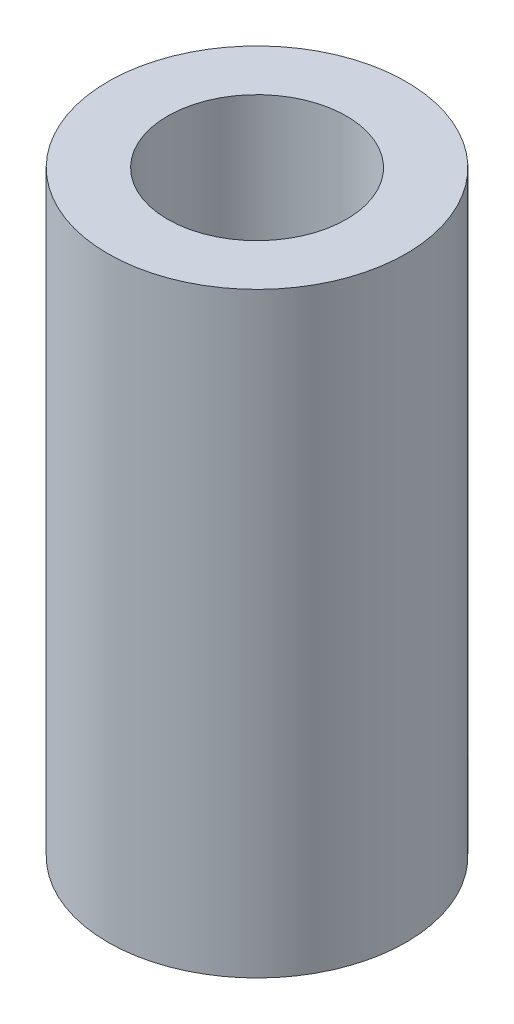
ISO-10303-21;
HEADER;
FILE_DESCRIPTION(('STEP AP214'),'2;1');
FILE_NAME('part.step','',(''),(''),'','','');
FILE_SCHEMA(('AUTOMOTIVE_DESIGN { 1 0 10303 214 1 1 1 1 }'));
ENDSEC;
DATA;
#1=APPLICATION_CONTEXT('core data for automotive mechanical design processes');
#2=APPLICATION_PROTOCOL_DEFINITION('international standard','automotive_design',2000,#1);
#3=PRODUCT_CONTEXT('',#1,'mechanical');
#4=PRODUCT('Part','Part','',(#3));
#5=PRODUCT_RELATED_PRODUCT_CATEGORY('part','',(#4));
#6=PRODUCT_DEFINITION_FORMATION('','',#4);
#7=PRODUCT_DEFINITION_CONTEXT('part definition',#1,'design');
#8=PRODUCT_DEFINITION('design','',#6,#7);
#9=PRODUCT_DEFINITION_SHAPE('','',#8);
#10=(LENGTH_UNIT() NAMED_UNIT(*) SI_UNIT(.MILLI.,.METRE.));
#11=(NAMED_UNIT(*) PLANE_ANGLE_UNIT() SI_UNIT($,.RADIAN.));
#12=(NAMED_UNIT(*) SI_UNIT($,.STERADIAN.) SOLID_ANGLE_UNIT());
#13=UNCERTAINTY_MEASURE_WITH_UNIT(LENGTH_MEASURE(1.E-05),#10,'distance_accuracy_value','');
#14=(GEOMETRIC_REPRESENTATION_CONTEXT(3) GLOBAL_UNCERTAINTY_ASSIGNED_CONTEXT((#13)) GLOBAL_UNIT_ASSIGNED_CONTEXT((#10,
#11,#12)) REPRESENTATION_CONTEXT('',''));
#15=CARTESIAN_POINT('',(0.,0.,0.));
#16=DIRECTION('',(0.,0.,1.));
#17=DIRECTION('',(1.,0.,0.));
#18=AXIS2_PLACEMENT_3D('',#15,#16,#17);
#19=CARTESIAN_POINT('',(0.,10.,0.));
#20=DIRECTION('',(0.,1.,0.));
#21=DIRECTION('',(0.,0.,1.));
#22=AXIS2_PLACEMENT_3D('',#19,#20,#21);
#23=PLANE('',#22);
#24=CARTESIAN_POINT('',(0.,10.,0.));
#25=DIRECTION('',(0.,1.,0.));
#26=DIRECTION('',(0.,0.,1.));
#27=AXIS2_PLACEMENT_3D('',#24,#25,#26);
#28=CIRCLE('',#27,2.5);
#29=CARTESIAN_POINT('',(0.,10.,2.5));
#30=VERTEX_POINT('',#29);
#31=EDGE_CURVE('E10',#30,#30,#28,.T.);
#32=ORIENTED_EDGE('',*,*,#31,.T.);
#33=EDGE_LOOP('',(#32));
#34=FACE_BOUND('',#33,.T.);
#35=CARTESIAN_POINT('',(0.,10.,0.));
#36=DIRECTION('',(0.,1.,0.));
#37=DIRECTION('',(0.,0.,1.));
#38=AXIS2_PLACEMENT_3D('',#35,#36,#37);
#39=CIRCLE('',#38,1.5);
#40=CARTESIAN_POINT('',(0.,10.,1.5));
#41=VERTEX_POINT('',#40);
#42=EDGE_CURVE('E41',#41,#41,#39,.T.);
#43=ORIENTED_EDGE('',*,*,#42,.F.);
#44=EDGE_LOOP('',(#43));
#45=FACE_BOUND('',#44,.T.);
#46=ADVANCED_FACE('F30',(#34,#45),#23,.T.);
#47=CARTESIAN_POINT('',(0.,0.,0.));
#48=DIRECTION('',(0.,1.,0.));
#49=DIRECTION('',(0.,0.,1.));
#50=AXIS2_PLACEMENT_3D('',#47,#48,#49);
#51=PLANE('',#50);
#52=CARTESIAN_POINT('',(0.,0.,0.));
#53=DIRECTION('',(0.,1.,0.));
#54=DIRECTION('',(0.,0.,1.));
#55=AXIS2_PLACEMENT_3D('',#52,#53,#54);
#56=CIRCLE('',#55,2.5);
#57=CARTESIAN_POINT('',(0.,0.,2.5));
#58=VERTEX_POINT('',#57);
#59=EDGE_CURVE('E34',#58,#58,#56,.T.);
#60=ORIENTED_EDGE('',*,*,#59,.F.);
#61=EDGE_LOOP('',(#60));
#62=FACE_BOUND('',#61,.T.);
#63=CARTESIAN_POINT('',(0.,0.,0.));
#64=DIRECTION('',(0.,1.,0.));
#65=DIRECTION('',(0.,0.,1.));
#66=AXIS2_PLACEMENT_3D('',#63,#64,#65);
#67=CIRCLE('',#66,1.5);
#68=CARTESIAN_POINT('',(0.,0.,1.5));
#69=VERTEX_POINT('',#68);
#70=EDGE_CURVE('E43',#69,#69,#67,.T.);
#71=ORIENTED_EDGE('',*,*,#70,.T.);
#72=EDGE_LOOP('',(#71));
#73=FACE_BOUND('',#72,.T.);
#74=ADVANCED_FACE('F53',(#62,#73),#51,.F.);
#75=CARTESIAN_POINT('',(0.,10.,0.));
#76=DIRECTION('',(0.,-1.,0.));
#77=DIRECTION('',(0.,0.,-1.));
#78=AXIS2_PLACEMENT_3D('',#75,#76,#77);
#79=CYLINDRICAL_SURFACE('',#78,2.5);
#80=ORIENTED_EDGE('',*,*,#31,.F.);
#81=EDGE_LOOP('',(#80));
#82=FACE_BOUND('',#81,.T.);
#83=ORIENTED_EDGE('',*,*,#59,.T.);
#84=EDGE_LOOP('',(#83));
#85=FACE_BOUND('',#84,.T.);
#86=ADVANCED_FACE('F32',(#82,#85),#79,.T.);
#87=CARTESIAN_POINT('',(0.,10.,0.));
#88=DIRECTION('',(0.,-1.,0.));
#89=DIRECTION('',(0.,0.,-1.));
#90=AXIS2_PLACEMENT_3D('',#87,#88,#89);
#91=CYLINDRICAL_SURFACE('',#90,1.5);
#92=ORIENTED_EDGE('',*,*,#42,.T.);
#93=EDGE_LOOP('',(#92));
#94=FACE_BOUND('',#93,.T.);
#95=ORIENTED_EDGE('',*,*,#70,.F.);
#96=EDGE_LOOP('',(#95));
#97=FACE_BOUND('',#96,.T.);
#98=ADVANCED_FACE('F49',(#94,#97),#91,.F.);
#99=CLOSED_SHELL('',(#46,#74,#86,#98));
#100=MANIFOLD_SOLID_BREP('B2',#99);
#101=ADVANCED_BREP_SHAPE_REPRESENTATION('',(#18,#100),#14);
#102=SHAPE_DEFINITION_REPRESENTATION(#9,#101);
ENDSEC;
END-ISO-10303-21;
